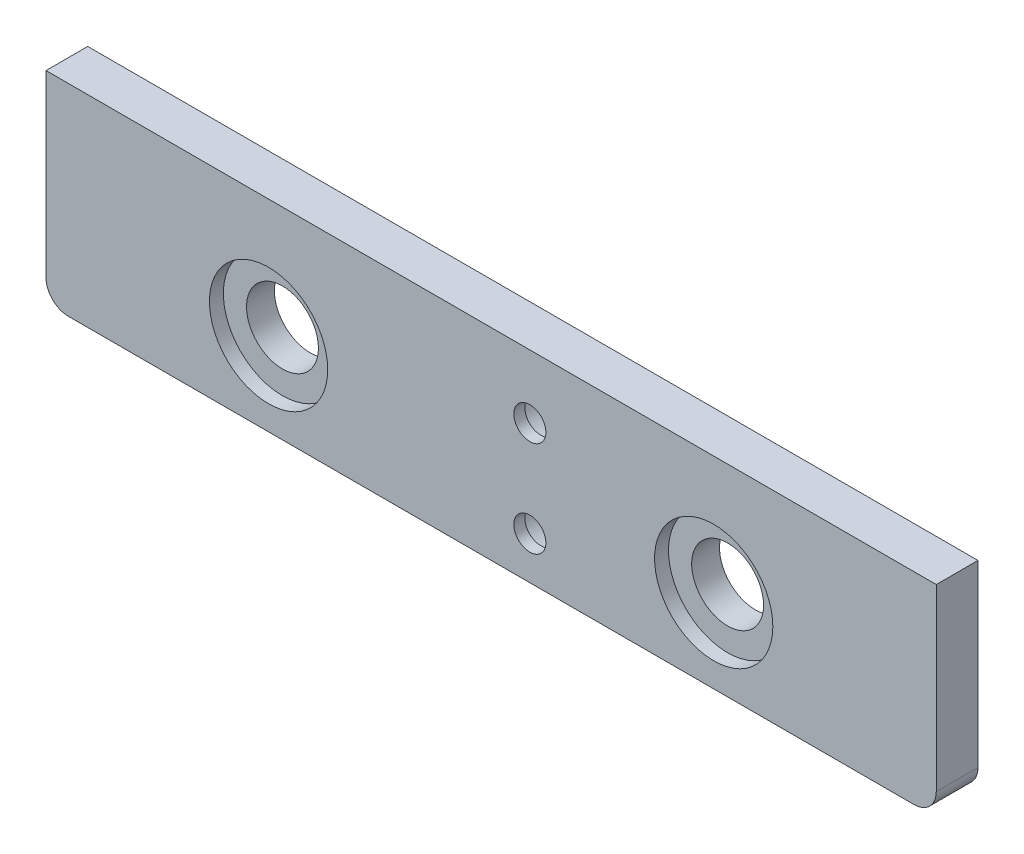
ISO-10303-21;
HEADER;
FILE_DESCRIPTION(('STEP AP214'),'2;1');
FILE_NAME('part.step','',(''),(''),'','','');
FILE_SCHEMA(('AUTOMOTIVE_DESIGN { 1 0 10303 214 1 1 1 1 }'));
ENDSEC;
DATA;
#1=APPLICATION_CONTEXT('core data for automotive mechanical design processes');
#2=APPLICATION_PROTOCOL_DEFINITION('international standard','automotive_design',2000,#1);
#3=PRODUCT_CONTEXT('',#1,'mechanical');
#4=PRODUCT('Part','Part','',(#3));
#5=PRODUCT_RELATED_PRODUCT_CATEGORY('part','',(#4));
#6=PRODUCT_DEFINITION_FORMATION('','',#4);
#7=PRODUCT_DEFINITION_CONTEXT('part definition',#1,'design');
#8=PRODUCT_DEFINITION('design','',#6,#7);
#9=PRODUCT_DEFINITION_SHAPE('','',#8);
#10=(LENGTH_UNIT() NAMED_UNIT(*) SI_UNIT(.MILLI.,.METRE.));
#11=(NAMED_UNIT(*) PLANE_ANGLE_UNIT() SI_UNIT($,.RADIAN.));
#12=(NAMED_UNIT(*) SI_UNIT($,.STERADIAN.) SOLID_ANGLE_UNIT());
#13=UNCERTAINTY_MEASURE_WITH_UNIT(LENGTH_MEASURE(1.E-05),#10,'distance_accuracy_value','');
#14=(GEOMETRIC_REPRESENTATION_CONTEXT(3) GLOBAL_UNCERTAINTY_ASSIGNED_CONTEXT((#13)) GLOBAL_UNIT_ASSIGNED_CONTEXT((#10,
#11,#12)) REPRESENTATION_CONTEXT('',''));
#15=CARTESIAN_POINT('',(0.,0.,0.));
#16=DIRECTION('',(0.,0.,1.));
#17=DIRECTION('',(1.,0.,0.));
#18=AXIS2_PLACEMENT_3D('',#15,#16,#17);
#19=CARTESIAN_POINT('',(0.,0.,4.7625));
#20=DIRECTION('',(1.,0.,0.));
#21=DIRECTION('',(0.,0.,-1.));
#22=AXIS2_PLACEMENT_3D('',#19,#20,#21);
#23=PLANE('',#22);
#24=DIRECTION('',(0.,-1.,0.));
#25=VECTOR('',#24,1.);
#26=CARTESIAN_POINT('',(0.,0.,0.));
#27=LINE('',#26,#25);
#28=CARTESIAN_POINT('',(0.,23.0124,0.));
#29=VERTEX_POINT('',#28);
#30=CARTESIAN_POINT('',(0.,2.54,0.));
#31=VERTEX_POINT('',#30);
#32=EDGE_CURVE('E114',#29,#31,#27,.T.);
#33=ORIENTED_EDGE('',*,*,#32,.T.);
#34=DIRECTION('',(0.,0.,-1.));
#35=VECTOR('',#34,1.);
#36=CARTESIAN_POINT('',(0.,2.54,4.7625));
#37=LINE('',#36,#35);
#38=CARTESIAN_POINT('',(0.,2.54,4.7625));
#39=VERTEX_POINT('',#38);
#40=EDGE_CURVE('E58',#31,#39,#37,.F.);
#41=ORIENTED_EDGE('',*,*,#40,.T.);
#42=DIRECTION('',(0.,-1.,0.));
#43=VECTOR('',#42,1.);
#44=CARTESIAN_POINT('',(0.,0.,4.7625));
#45=LINE('',#44,#43);
#46=CARTESIAN_POINT('',(0.,23.0124,4.7625));
#47=VERTEX_POINT('',#46);
#48=EDGE_CURVE('E122',#47,#39,#45,.T.);
#49=ORIENTED_EDGE('',*,*,#48,.F.);
#50=DIRECTION('',(0.,0.,-1.));
#51=VECTOR('',#50,1.);
#52=CARTESIAN_POINT('',(0.,23.0124,4.7625));
#53=LINE('',#52,#51);
#54=EDGE_CURVE('E106',#47,#29,#53,.T.);
#55=ORIENTED_EDGE('',*,*,#54,.T.);
#56=EDGE_LOOP('',(#33,#41,#49,#55));
#57=FACE_BOUND('',#56,.T.);
#58=ADVANCED_FACE('F35',(#57),#23,.F.);
#59=CARTESIAN_POINT('',(0.,0.,4.7625));
#60=DIRECTION('',(0.,1.,0.));
#61=DIRECTION('',(0.,0.,1.));
#62=AXIS2_PLACEMENT_3D('',#59,#60,#61);
#63=PLANE('',#62);
#64=DIRECTION('',(1.,0.,0.));
#65=VECTOR('',#64,1.);
#66=CARTESIAN_POINT('',(0.,0.,4.7625));
#67=LINE('',#66,#65);
#68=CARTESIAN_POINT('',(2.54,0.,4.7625));
#69=VERTEX_POINT('',#68);
#70=CARTESIAN_POINT('',(99.06,0.,4.7625));
#71=VERTEX_POINT('',#70);
#72=EDGE_CURVE('E96',#69,#71,#67,.T.);
#73=ORIENTED_EDGE('',*,*,#72,.F.);
#74=DIRECTION('',(0.,0.,-1.));
#75=VECTOR('',#74,1.);
#76=CARTESIAN_POINT('',(2.54,0.,4.7625));
#77=LINE('',#76,#75);
#78=CARTESIAN_POINT('',(2.54,0.,0.));
#79=VERTEX_POINT('',#78);
#80=EDGE_CURVE('E125',#69,#79,#77,.T.);
#81=ORIENTED_EDGE('',*,*,#80,.T.);
#82=DIRECTION('',(1.,0.,0.));
#83=VECTOR('',#82,1.);
#84=CARTESIAN_POINT('',(0.,0.,0.));
#85=LINE('',#84,#83);
#86=CARTESIAN_POINT('',(99.06,0.,0.));
#87=VERTEX_POINT('',#86);
#88=EDGE_CURVE('E116',#79,#87,#85,.T.);
#89=ORIENTED_EDGE('',*,*,#88,.T.);
#90=DIRECTION('',(0.,0.,-1.));
#91=VECTOR('',#90,1.);
#92=CARTESIAN_POINT('',(99.06,0.,4.7625));
#93=LINE('',#92,#91);
#94=EDGE_CURVE('E105',#87,#71,#93,.F.);
#95=ORIENTED_EDGE('',*,*,#94,.T.);
#96=EDGE_LOOP('',(#73,#81,#89,#95));
#97=FACE_BOUND('',#96,.T.);
#98=ADVANCED_FACE('F138',(#97),#63,.F.);
#99=CARTESIAN_POINT('',(101.6,0.,4.7625));
#100=DIRECTION('',(-1.,0.,0.));
#101=DIRECTION('',(0.,0.,1.));
#102=AXIS2_PLACEMENT_3D('',#99,#100,#101);
#103=PLANE('',#102);
#104=DIRECTION('',(0.,1.,0.));
#105=VECTOR('',#104,1.);
#106=CARTESIAN_POINT('',(101.6,0.,4.7625));
#107=LINE('',#106,#105);
#108=CARTESIAN_POINT('',(101.6,2.54,4.7625));
#109=VERTEX_POINT('',#108);
#110=CARTESIAN_POINT('',(101.6,23.0124,4.7625));
#111=VERTEX_POINT('',#110);
#112=EDGE_CURVE('E88',#109,#111,#107,.T.);
#113=ORIENTED_EDGE('',*,*,#112,.F.);
#114=DIRECTION('',(0.,0.,-1.));
#115=VECTOR('',#114,1.);
#116=CARTESIAN_POINT('',(101.6,2.54,4.7625));
#117=LINE('',#116,#115);
#118=CARTESIAN_POINT('',(101.6,2.54,0.));
#119=VERTEX_POINT('',#118);
#120=EDGE_CURVE('E11',#109,#119,#117,.T.);
#121=ORIENTED_EDGE('',*,*,#120,.T.);
#122=DIRECTION('',(0.,1.,0.));
#123=VECTOR('',#122,1.);
#124=CARTESIAN_POINT('',(101.6,0.,0.));
#125=LINE('',#124,#123);
#126=CARTESIAN_POINT('',(101.6,23.0124,0.));
#127=VERTEX_POINT('',#126);
#128=EDGE_CURVE('E102',#119,#127,#125,.T.);
#129=ORIENTED_EDGE('',*,*,#128,.T.);
#130=DIRECTION('',(0.,0.,-1.));
#131=VECTOR('',#130,1.);
#132=CARTESIAN_POINT('',(101.6,23.0124,4.7625));
#133=LINE('',#132,#131);
#134=EDGE_CURVE('E99',#111,#127,#133,.T.);
#135=ORIENTED_EDGE('',*,*,#134,.F.);
#136=EDGE_LOOP('',(#113,#121,#129,#135));
#137=FACE_BOUND('',#136,.T.);
#138=ADVANCED_FACE('F100',(#137),#103,.F.);
#139=CARTESIAN_POINT('',(0.,23.0124,4.7625));
#140=DIRECTION('',(0.,-1.,0.));
#141=DIRECTION('',(0.,0.,-1.));
#142=AXIS2_PLACEMENT_3D('',#139,#140,#141);
#143=PLANE('',#142);
#144=DIRECTION('',(-1.,0.,0.));
#145=VECTOR('',#144,1.);
#146=CARTESIAN_POINT('',(0.,23.0124,0.));
#147=LINE('',#146,#145);
#148=EDGE_CURVE('E121',#127,#29,#147,.T.);
#149=ORIENTED_EDGE('',*,*,#148,.T.);
#150=ORIENTED_EDGE('',*,*,#54,.F.);
#151=DIRECTION('',(-1.,0.,0.));
#152=VECTOR('',#151,1.);
#153=CARTESIAN_POINT('',(0.,23.0124,4.7625));
#154=LINE('',#153,#152);
#155=EDGE_CURVE('E92',#111,#47,#154,.T.);
#156=ORIENTED_EDGE('',*,*,#155,.F.);
#157=ORIENTED_EDGE('',*,*,#134,.T.);
#158=EDGE_LOOP('',(#149,#150,#156,#157));
#159=FACE_BOUND('',#158,.T.);
#160=ADVANCED_FACE('F108',(#159),#143,.F.);
#161=CARTESIAN_POINT('',(0.,0.,4.7625));
#162=DIRECTION('',(0.,0.,-1.));
#163=DIRECTION('',(-1.,0.,0.));
#164=AXIS2_PLACEMENT_3D('',#161,#162,#163);
#165=PLANE('',#164);
#166=CARTESIAN_POINT('',(55.2186907568477,15.7733999999998,4.7625));
#167=DIRECTION('',(0.,0.,-1.));
#168=DIRECTION('',(-1.,0.,0.));
#169=AXIS2_PLACEMENT_3D('',#166,#167,#168);
#170=CIRCLE('',#169,1.8288);
#171=CARTESIAN_POINT('',(53.3898907568477,15.7733999999998,4.7625));
#172=VERTEX_POINT('',#171);
#173=EDGE_CURVE('E182',#172,#172,#170,.T.);
#174=ORIENTED_EDGE('',*,*,#173,.T.);
#175=EDGE_LOOP('',(#174));
#176=FACE_BOUND('',#175,.T.);
#177=CARTESIAN_POINT('',(55.2186907568477,4.85139999999975,4.7625));
#178=DIRECTION('',(0.,0.,-1.));
#179=DIRECTION('',(-1.,0.,0.));
#180=AXIS2_PLACEMENT_3D('',#177,#178,#179);
#181=CIRCLE('',#180,1.8288);
#182=CARTESIAN_POINT('',(53.3898907568477,4.85139999999975,4.7625));
#183=VERTEX_POINT('',#182);
#184=EDGE_CURVE('E170',#183,#183,#181,.T.);
#185=ORIENTED_EDGE('',*,*,#184,.T.);
#186=EDGE_LOOP('',(#185));
#187=FACE_BOUND('',#186,.T.);
#188=CARTESIAN_POINT('',(25.4,9.525,4.7625));
#189=DIRECTION('',(0.,0.,1.));
#190=DIRECTION('',(1.,0.,0.));
#191=AXIS2_PLACEMENT_3D('',#188,#189,#190);
#192=CIRCLE('',#191,6.74751);
#193=CARTESIAN_POINT('',(32.14751,9.525,4.7625));
#194=VERTEX_POINT('',#193);
#195=EDGE_CURVE('E167',#194,#194,#192,.T.);
#196=ORIENTED_EDGE('',*,*,#195,.F.);
#197=EDGE_LOOP('',(#196));
#198=FACE_BOUND('',#197,.T.);
#199=CARTESIAN_POINT('',(76.2,9.525,4.7625));
#200=DIRECTION('',(0.,0.,1.));
#201=DIRECTION('',(1.,0.,0.));
#202=AXIS2_PLACEMENT_3D('',#199,#200,#201);
#203=CIRCLE('',#202,6.74751);
#204=CARTESIAN_POINT('',(82.94751,9.525,4.7625));
#205=VERTEX_POINT('',#204);
#206=EDGE_CURVE('E155',#205,#205,#203,.T.);
#207=ORIENTED_EDGE('',*,*,#206,.F.);
#208=EDGE_LOOP('',(#207));
#209=FACE_BOUND('',#208,.T.);
#210=ORIENTED_EDGE('',*,*,#48,.T.);
#211=CARTESIAN_POINT('',(2.54,2.54,4.7625));
#212=DIRECTION('',(0.,0.,-1.));
#213=DIRECTION('',(-1.,0.,0.));
#214=AXIS2_PLACEMENT_3D('',#211,#212,#213);
#215=CIRCLE('',#214,2.54);
#216=EDGE_CURVE('E43',#39,#69,#215,.F.);
#217=ORIENTED_EDGE('',*,*,#216,.T.);
#218=ORIENTED_EDGE('',*,*,#72,.T.);
#219=CARTESIAN_POINT('',(99.06,2.54,4.7625));
#220=DIRECTION('',(0.,0.,-1.));
#221=DIRECTION('',(-1.,0.,0.));
#222=AXIS2_PLACEMENT_3D('',#219,#220,#221);
#223=CIRCLE('',#222,2.54);
#224=EDGE_CURVE('E50',#71,#109,#223,.F.);
#225=ORIENTED_EDGE('',*,*,#224,.T.);
#226=ORIENTED_EDGE('',*,*,#112,.T.);
#227=ORIENTED_EDGE('',*,*,#155,.T.);
#228=EDGE_LOOP('',(#210,#217,#218,#225,#226,#227));
#229=FACE_BOUND('',#228,.T.);
#230=ADVANCED_FACE('F90',(#176,#187,#198,#209,#229),#165,.F.);
#231=CARTESIAN_POINT('',(0.,0.,0.));
#232=DIRECTION('',(0.,0.,-1.));
#233=DIRECTION('',(-1.,0.,0.));
#234=AXIS2_PLACEMENT_3D('',#231,#232,#233);
#235=PLANE('',#234);
#236=CARTESIAN_POINT('',(55.2186907568477,15.7733999999998,0.));
#237=DIRECTION('',(0.,0.,-1.));
#238=DIRECTION('',(-1.,0.,0.));
#239=AXIS2_PLACEMENT_3D('',#236,#237,#238);
#240=CIRCLE('',#239,3.57250999999999);
#241=CARTESIAN_POINT('',(51.6461807568477,15.7733999999998,0.));
#242=VERTEX_POINT('',#241);
#243=EDGE_CURVE('E191',#242,#242,#240,.T.);
#244=ORIENTED_EDGE('',*,*,#243,.F.);
#245=EDGE_LOOP('',(#244));
#246=FACE_BOUND('',#245,.T.);
#247=CARTESIAN_POINT('',(55.2186907568477,4.85139999999975,0.));
#248=DIRECTION('',(0.,0.,-1.));
#249=DIRECTION('',(-1.,0.,0.));
#250=AXIS2_PLACEMENT_3D('',#247,#248,#249);
#251=CIRCLE('',#250,3.57250999999999);
#252=CARTESIAN_POINT('',(51.6461807568477,4.85139999999975,0.));
#253=VERTEX_POINT('',#252);
#254=EDGE_CURVE('E179',#253,#253,#251,.T.);
#255=ORIENTED_EDGE('',*,*,#254,.F.);
#256=EDGE_LOOP('',(#255));
#257=FACE_BOUND('',#256,.T.);
#258=CARTESIAN_POINT('',(25.4,9.525,0.));
#259=DIRECTION('',(0.,0.,1.));
#260=DIRECTION('',(1.,0.,0.));
#261=AXIS2_PLACEMENT_3D('',#258,#259,#260);
#262=CIRCLE('',#261,4.1021);
#263=CARTESIAN_POINT('',(29.5021,9.525,0.));
#264=VERTEX_POINT('',#263);
#265=EDGE_CURVE('E158',#264,#264,#262,.T.);
#266=ORIENTED_EDGE('',*,*,#265,.T.);
#267=EDGE_LOOP('',(#266));
#268=FACE_BOUND('',#267,.T.);
#269=CARTESIAN_POINT('',(76.2,9.525,0.));
#270=DIRECTION('',(0.,0.,1.));
#271=DIRECTION('',(1.,0.,0.));
#272=AXIS2_PLACEMENT_3D('',#269,#270,#271);
#273=CIRCLE('',#272,4.1021);
#274=CARTESIAN_POINT('',(80.3021,9.525,0.));
#275=VERTEX_POINT('',#274);
#276=EDGE_CURVE('E117',#275,#275,#273,.T.);
#277=ORIENTED_EDGE('',*,*,#276,.T.);
#278=EDGE_LOOP('',(#277));
#279=FACE_BOUND('',#278,.T.);
#280=ORIENTED_EDGE('',*,*,#88,.F.);
#281=CARTESIAN_POINT('',(2.54,2.54,0.));
#282=DIRECTION('',(0.,0.,-1.));
#283=DIRECTION('',(-1.,0.,0.));
#284=AXIS2_PLACEMENT_3D('',#281,#282,#283);
#285=CIRCLE('',#284,2.54);
#286=EDGE_CURVE('E130',#79,#31,#285,.T.);
#287=ORIENTED_EDGE('',*,*,#286,.T.);
#288=ORIENTED_EDGE('',*,*,#32,.F.);
#289=ORIENTED_EDGE('',*,*,#148,.F.);
#290=ORIENTED_EDGE('',*,*,#128,.F.);
#291=CARTESIAN_POINT('',(99.06,2.54,0.));
#292=DIRECTION('',(0.,0.,-1.));
#293=DIRECTION('',(-1.,0.,0.));
#294=AXIS2_PLACEMENT_3D('',#291,#292,#293);
#295=CIRCLE('',#294,2.54);
#296=EDGE_CURVE('E128',#119,#87,#295,.T.);
#297=ORIENTED_EDGE('',*,*,#296,.T.);
#298=EDGE_LOOP('',(#280,#287,#288,#289,#290,#297));
#299=FACE_BOUND('',#298,.T.);
#300=ADVANCED_FACE('F144',(#246,#257,#268,#279,#299),#235,.T.);
#301=CARTESIAN_POINT('',(76.2,9.525,4.7625));
#302=DIRECTION('',(0.,0.,1.));
#303=DIRECTION('',(1.,0.,0.));
#304=AXIS2_PLACEMENT_3D('',#301,#302,#303);
#305=CYLINDRICAL_SURFACE('',#304,4.1021);
#306=ORIENTED_EDGE('',*,*,#276,.F.);
#307=EDGE_LOOP('',(#306));
#308=FACE_BOUND('',#307,.T.);
#309=CARTESIAN_POINT('',(76.2,9.525,3.175));
#310=DIRECTION('',(0.,0.,1.));
#311=DIRECTION('',(1.,0.,0.));
#312=AXIS2_PLACEMENT_3D('',#309,#310,#311);
#313=CIRCLE('',#312,4.1021);
#314=CARTESIAN_POINT('',(80.3021,9.525,3.175));
#315=VERTEX_POINT('',#314);
#316=EDGE_CURVE('E149',#315,#315,#313,.T.);
#317=ORIENTED_EDGE('',*,*,#316,.T.);
#318=EDGE_LOOP('',(#317));
#319=FACE_BOUND('',#318,.T.);
#320=ADVANCED_FACE('F199',(#308,#319),#305,.F.);
#321=CARTESIAN_POINT('',(80.3021,9.525,3.175));
#322=DIRECTION('',(0.,0.,-1.));
#323=DIRECTION('',(-1.,0.,0.));
#324=AXIS2_PLACEMENT_3D('',#321,#322,#323);
#325=PLANE('',#324);
#326=ORIENTED_EDGE('',*,*,#316,.F.);
#327=EDGE_LOOP('',(#326));
#328=FACE_BOUND('',#327,.T.);
#329=CARTESIAN_POINT('',(76.2,9.525,3.175));
#330=DIRECTION('',(0.,0.,1.));
#331=DIRECTION('',(1.,0.,0.));
#332=AXIS2_PLACEMENT_3D('',#329,#330,#331);
#333=CIRCLE('',#332,6.74751);
#334=CARTESIAN_POINT('',(82.94751,9.525,3.175));
#335=VERTEX_POINT('',#334);
#336=EDGE_CURVE('E152',#335,#335,#333,.T.);
#337=ORIENTED_EDGE('',*,*,#336,.T.);
#338=EDGE_LOOP('',(#337));
#339=FACE_BOUND('',#338,.T.);
#340=ADVANCED_FACE('F209',(#328,#339),#325,.F.);
#341=CARTESIAN_POINT('',(76.2,9.525,4.7625));
#342=DIRECTION('',(0.,0.,1.));
#343=DIRECTION('',(1.,0.,0.));
#344=AXIS2_PLACEMENT_3D('',#341,#342,#343);
#345=CYLINDRICAL_SURFACE('',#344,6.74751);
#346=ORIENTED_EDGE('',*,*,#336,.F.);
#347=EDGE_LOOP('',(#346));
#348=FACE_BOUND('',#347,.T.);
#349=ORIENTED_EDGE('',*,*,#206,.T.);
#350=EDGE_LOOP('',(#349));
#351=FACE_BOUND('',#350,.T.);
#352=ADVANCED_FACE('F215',(#348,#351),#345,.F.);
#353=CARTESIAN_POINT('',(25.4,9.525,4.7625));
#354=DIRECTION('',(0.,0.,1.));
#355=DIRECTION('',(1.,0.,0.));
#356=AXIS2_PLACEMENT_3D('',#353,#354,#355);
#357=CYLINDRICAL_SURFACE('',#356,4.1021);
#358=ORIENTED_EDGE('',*,*,#265,.F.);
#359=EDGE_LOOP('',(#358));
#360=FACE_BOUND('',#359,.T.);
#361=CARTESIAN_POINT('',(25.4,9.525,3.175));
#362=DIRECTION('',(0.,0.,1.));
#363=DIRECTION('',(1.,0.,0.));
#364=AXIS2_PLACEMENT_3D('',#361,#362,#363);
#365=CIRCLE('',#364,4.1021);
#366=CARTESIAN_POINT('',(29.5021,9.525,3.175));
#367=VERTEX_POINT('',#366);
#368=EDGE_CURVE('E161',#367,#367,#365,.T.);
#369=ORIENTED_EDGE('',*,*,#368,.T.);
#370=EDGE_LOOP('',(#369));
#371=FACE_BOUND('',#370,.T.);
#372=ADVANCED_FACE('F221',(#360,#371),#357,.F.);
#373=CARTESIAN_POINT('',(29.5021,9.525,3.175));
#374=DIRECTION('',(0.,0.,-1.));
#375=DIRECTION('',(-1.,0.,0.));
#376=AXIS2_PLACEMENT_3D('',#373,#374,#375);
#377=PLANE('',#376);
#378=ORIENTED_EDGE('',*,*,#368,.F.);
#379=EDGE_LOOP('',(#378));
#380=FACE_BOUND('',#379,.T.);
#381=CARTESIAN_POINT('',(25.4,9.525,3.175));
#382=DIRECTION('',(0.,0.,1.));
#383=DIRECTION('',(1.,0.,0.));
#384=AXIS2_PLACEMENT_3D('',#381,#382,#383);
#385=CIRCLE('',#384,6.74751);
#386=CARTESIAN_POINT('',(32.14751,9.525,3.175));
#387=VERTEX_POINT('',#386);
#388=EDGE_CURVE('E164',#387,#387,#385,.T.);
#389=ORIENTED_EDGE('',*,*,#388,.T.);
#390=EDGE_LOOP('',(#389));
#391=FACE_BOUND('',#390,.T.);
#392=ADVANCED_FACE('F275',(#380,#391),#377,.F.);
#393=CARTESIAN_POINT('',(25.4,9.525,4.7625));
#394=DIRECTION('',(0.,0.,1.));
#395=DIRECTION('',(1.,0.,0.));
#396=AXIS2_PLACEMENT_3D('',#393,#394,#395);
#397=CYLINDRICAL_SURFACE('',#396,6.74751);
#398=ORIENTED_EDGE('',*,*,#388,.F.);
#399=EDGE_LOOP('',(#398));
#400=FACE_BOUND('',#399,.T.);
#401=ORIENTED_EDGE('',*,*,#195,.T.);
#402=EDGE_LOOP('',(#401));
#403=FACE_BOUND('',#402,.T.);
#404=ADVANCED_FACE('F271',(#400,#403),#397,.F.);
#405=CARTESIAN_POINT('',(55.2186907568477,4.85139999999975,0.));
#406=DIRECTION('',(0.,0.,-1.));
#407=DIRECTION('',(-1.,0.,0.));
#408=AXIS2_PLACEMENT_3D('',#405,#406,#407);
#409=CYLINDRICAL_SURFACE('',#408,1.8288);
#410=ORIENTED_EDGE('',*,*,#184,.F.);
#411=EDGE_LOOP('',(#410));
#412=FACE_BOUND('',#411,.T.);
#413=CARTESIAN_POINT('',(55.2186907568477,4.85139999999975,3.5052));
#414=DIRECTION('',(0.,0.,-1.));
#415=DIRECTION('',(-1.,0.,0.));
#416=AXIS2_PLACEMENT_3D('',#413,#414,#415);
#417=CIRCLE('',#416,1.8288);
#418=CARTESIAN_POINT('',(53.3898907568477,4.85139999999975,3.5052));
#419=VERTEX_POINT('',#418);
#420=EDGE_CURVE('E173',#419,#419,#417,.T.);
#421=ORIENTED_EDGE('',*,*,#420,.T.);
#422=EDGE_LOOP('',(#421));
#423=FACE_BOUND('',#422,.T.);
#424=ADVANCED_FACE('F267',(#412,#423),#409,.F.);
#425=CARTESIAN_POINT('',(57.0474907568477,4.85139999999975,3.5052));
#426=DIRECTION('',(0.,0.,1.));
#427=DIRECTION('',(1.,0.,0.));
#428=AXIS2_PLACEMENT_3D('',#425,#426,#427);
#429=PLANE('',#428);
#430=ORIENTED_EDGE('',*,*,#420,.F.);
#431=EDGE_LOOP('',(#430));
#432=FACE_BOUND('',#431,.T.);
#433=CARTESIAN_POINT('',(55.2186907568477,4.85139999999975,3.5052));
#434=DIRECTION('',(0.,0.,-1.));
#435=DIRECTION('',(-1.,0.,0.));
#436=AXIS2_PLACEMENT_3D('',#433,#434,#435);
#437=CIRCLE('',#436,3.57250999999999);
#438=CARTESIAN_POINT('',(51.6461807568477,4.85139999999975,3.5052));
#439=VERTEX_POINT('',#438);
#440=EDGE_CURVE('E176',#439,#439,#437,.T.);
#441=ORIENTED_EDGE('',*,*,#440,.T.);
#442=EDGE_LOOP('',(#441));
#443=FACE_BOUND('',#442,.T.);
#444=ADVANCED_FACE('F263',(#432,#443),#429,.F.);
#445=CARTESIAN_POINT('',(55.2186907568477,4.85139999999975,0.));
#446=DIRECTION('',(0.,0.,-1.));
#447=DIRECTION('',(-1.,0.,0.));
#448=AXIS2_PLACEMENT_3D('',#445,#446,#447);
#449=CYLINDRICAL_SURFACE('',#448,3.57250999999999);
#450=ORIENTED_EDGE('',*,*,#440,.F.);
#451=EDGE_LOOP('',(#450));
#452=FACE_BOUND('',#451,.T.);
#453=ORIENTED_EDGE('',*,*,#254,.T.);
#454=EDGE_LOOP('',(#453));
#455=FACE_BOUND('',#454,.T.);
#456=ADVANCED_FACE('F259',(#452,#455),#449,.F.);
#457=CARTESIAN_POINT('',(55.2186907568477,15.7733999999998,0.));
#458=DIRECTION('',(0.,0.,-1.));
#459=DIRECTION('',(-1.,0.,0.));
#460=AXIS2_PLACEMENT_3D('',#457,#458,#459);
#461=CYLINDRICAL_SURFACE('',#460,1.8288);
#462=ORIENTED_EDGE('',*,*,#173,.F.);
#463=EDGE_LOOP('',(#462));
#464=FACE_BOUND('',#463,.T.);
#465=CARTESIAN_POINT('',(55.2186907568477,15.7733999999998,3.5052));
#466=DIRECTION('',(0.,0.,-1.));
#467=DIRECTION('',(-1.,0.,0.));
#468=AXIS2_PLACEMENT_3D('',#465,#466,#467);
#469=CIRCLE('',#468,1.8288);
#470=CARTESIAN_POINT('',(53.3898907568477,15.7733999999998,3.5052));
#471=VERTEX_POINT('',#470);
#472=EDGE_CURVE('E185',#471,#471,#469,.T.);
#473=ORIENTED_EDGE('',*,*,#472,.T.);
#474=EDGE_LOOP('',(#473));
#475=FACE_BOUND('',#474,.T.);
#476=ADVANCED_FACE('F252',(#464,#475),#461,.F.);
#477=CARTESIAN_POINT('',(57.0474907568477,15.7733999999998,3.5052));
#478=DIRECTION('',(0.,0.,1.));
#479=DIRECTION('',(1.,0.,0.));
#480=AXIS2_PLACEMENT_3D('',#477,#478,#479);
#481=PLANE('',#480);
#482=ORIENTED_EDGE('',*,*,#472,.F.);
#483=EDGE_LOOP('',(#482));
#484=FACE_BOUND('',#483,.T.);
#485=CARTESIAN_POINT('',(55.2186907568477,15.7733999999998,3.5052));
#486=DIRECTION('',(0.,0.,-1.));
#487=DIRECTION('',(-1.,0.,0.));
#488=AXIS2_PLACEMENT_3D('',#485,#486,#487);
#489=CIRCLE('',#488,3.57250999999999);
#490=CARTESIAN_POINT('',(51.6461807568477,15.7733999999998,3.5052));
#491=VERTEX_POINT('',#490);
#492=EDGE_CURVE('E188',#491,#491,#489,.T.);
#493=ORIENTED_EDGE('',*,*,#492,.T.);
#494=EDGE_LOOP('',(#493));
#495=FACE_BOUND('',#494,.T.);
#496=ADVANCED_FACE('F246',(#484,#495),#481,.F.);
#497=CARTESIAN_POINT('',(55.2186907568477,15.7733999999998,0.));
#498=DIRECTION('',(0.,0.,-1.));
#499=DIRECTION('',(-1.,0.,0.));
#500=AXIS2_PLACEMENT_3D('',#497,#498,#499);
#501=CYLINDRICAL_SURFACE('',#500,3.57250999999999);
#502=ORIENTED_EDGE('',*,*,#492,.F.);
#503=EDGE_LOOP('',(#502));
#504=FACE_BOUND('',#503,.T.);
#505=ORIENTED_EDGE('',*,*,#243,.T.);
#506=EDGE_LOOP('',(#505));
#507=FACE_BOUND('',#506,.T.);
#508=ADVANCED_FACE('F195',(#504,#507),#501,.F.);
#509=CARTESIAN_POINT('',(2.54,2.54,4.7625));
#510=DIRECTION('',(0.,0.,-1.));
#511=DIRECTION('',(-1.,0.,0.));
#512=AXIS2_PLACEMENT_3D('',#509,#510,#511);
#513=CYLINDRICAL_SURFACE('',#512,2.54);
#514=ORIENTED_EDGE('',*,*,#216,.F.);
#515=ORIENTED_EDGE('',*,*,#40,.F.);
#516=ORIENTED_EDGE('',*,*,#286,.F.);
#517=ORIENTED_EDGE('',*,*,#80,.F.);
#518=EDGE_LOOP('',(#514,#515,#516,#517));
#519=FACE_BOUND('',#518,.T.);
#520=ADVANCED_FACE('F141',(#519),#513,.T.);
#521=CARTESIAN_POINT('',(99.06,2.54,4.7625));
#522=DIRECTION('',(0.,0.,-1.));
#523=DIRECTION('',(-1.,0.,0.));
#524=AXIS2_PLACEMENT_3D('',#521,#522,#523);
#525=CYLINDRICAL_SURFACE('',#524,2.54);
#526=ORIENTED_EDGE('',*,*,#224,.F.);
#527=ORIENTED_EDGE('',*,*,#94,.F.);
#528=ORIENTED_EDGE('',*,*,#296,.F.);
#529=ORIENTED_EDGE('',*,*,#120,.F.);
#530=EDGE_LOOP('',(#526,#527,#528,#529));
#531=FACE_BOUND('',#530,.T.);
#532=ADVANCED_FACE('F37',(#531),#525,.T.);
#533=CLOSED_SHELL('',(#58,#98,#138,#160,#230,#300,#320,#340,#352,#372,#392,#404,#424,#444,#456,
#476,#496,#508,#520,#532));
#534=MANIFOLD_SOLID_BREP('B2',#533);
#535=ADVANCED_BREP_SHAPE_REPRESENTATION('',(#18,#534),#14);
#536=SHAPE_DEFINITION_REPRESENTATION(#9,#535);
ENDSEC;
END-ISO-10303-21;
